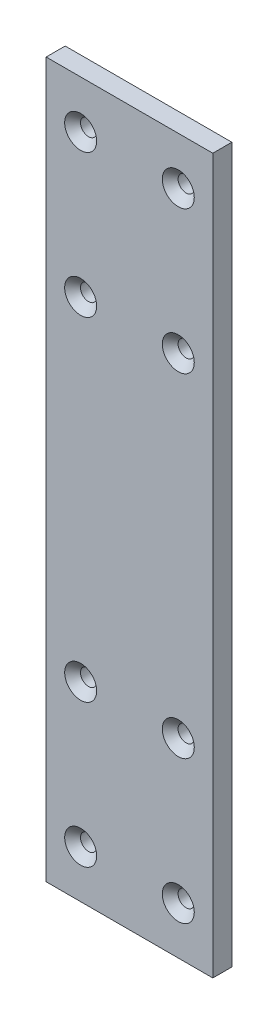
ISO-10303-21;
HEADER;
FILE_DESCRIPTION(('STEP AP214'),'2;1');
FILE_NAME('part.step','',(''),(''),'','','');
FILE_SCHEMA(('AUTOMOTIVE_DESIGN { 1 0 10303 214 1 1 1 1 }'));
ENDSEC;
DATA;
#1=APPLICATION_CONTEXT('core data for automotive mechanical design processes');
#2=APPLICATION_PROTOCOL_DEFINITION('international standard','automotive_design',2000,#1);
#3=PRODUCT_CONTEXT('',#1,'mechanical');
#4=PRODUCT('Part','Part','',(#3));
#5=PRODUCT_RELATED_PRODUCT_CATEGORY('part','',(#4));
#6=PRODUCT_DEFINITION_FORMATION('','',#4);
#7=PRODUCT_DEFINITION_CONTEXT('part definition',#1,'design');
#8=PRODUCT_DEFINITION('design','',#6,#7);
#9=PRODUCT_DEFINITION_SHAPE('','',#8);
#10=(LENGTH_UNIT() NAMED_UNIT(*) SI_UNIT(.MILLI.,.METRE.));
#11=(NAMED_UNIT(*) PLANE_ANGLE_UNIT() SI_UNIT($,.RADIAN.));
#12=(NAMED_UNIT(*) SI_UNIT($,.STERADIAN.) SOLID_ANGLE_UNIT());
#13=UNCERTAINTY_MEASURE_WITH_UNIT(LENGTH_MEASURE(1.E-05),#10,'distance_accuracy_value','');
#14=(GEOMETRIC_REPRESENTATION_CONTEXT(3) GLOBAL_UNCERTAINTY_ASSIGNED_CONTEXT((#13)) GLOBAL_UNIT_ASSIGNED_CONTEXT((#10,
#11,#12)) REPRESENTATION_CONTEXT('',''));
#15=CARTESIAN_POINT('',(0.,0.,0.));
#16=DIRECTION('',(0.,0.,1.));
#17=DIRECTION('',(1.,0.,0.));
#18=AXIS2_PLACEMENT_3D('',#15,#16,#17);
#19=CARTESIAN_POINT('',(17.5,75.,4.));
#20=DIRECTION('',(-1.,0.,0.));
#21=DIRECTION('',(0.,-1.,0.));
#22=AXIS2_PLACEMENT_3D('',#19,#20,#21);
#23=PLANE('',#22);
#24=DIRECTION('',(0.,1.,0.));
#25=VECTOR('',#24,1.);
#26=CARTESIAN_POINT('',(17.5,75.,0.));
#27=LINE('',#26,#25);
#28=CARTESIAN_POINT('',(17.5,-75.,0.));
#29=VERTEX_POINT('',#28);
#30=CARTESIAN_POINT('',(17.5,75.,0.));
#31=VERTEX_POINT('',#30);
#32=EDGE_CURVE('E98',#29,#31,#27,.T.);
#33=ORIENTED_EDGE('',*,*,#32,.T.);
#34=DIRECTION('',(0.,0.,-1.));
#35=VECTOR('',#34,1.);
#36=CARTESIAN_POINT('',(17.5,75.,4.));
#37=LINE('',#36,#35);
#38=CARTESIAN_POINT('',(17.5,75.,4.));
#39=VERTEX_POINT('',#38);
#40=EDGE_CURVE('E11',#39,#31,#37,.T.);
#41=ORIENTED_EDGE('',*,*,#40,.F.);
#42=DIRECTION('',(0.,1.,0.));
#43=VECTOR('',#42,1.);
#44=CARTESIAN_POINT('',(17.5,75.,4.));
#45=LINE('',#44,#43);
#46=CARTESIAN_POINT('',(17.5,-75.,4.));
#47=VERTEX_POINT('',#46);
#48=EDGE_CURVE('E86',#47,#39,#45,.T.);
#49=ORIENTED_EDGE('',*,*,#48,.F.);
#50=DIRECTION('',(0.,0.,-1.));
#51=VECTOR('',#50,1.);
#52=CARTESIAN_POINT('',(17.5,-75.,4.));
#53=LINE('',#52,#51);
#54=EDGE_CURVE('E94',#47,#29,#53,.T.);
#55=ORIENTED_EDGE('',*,*,#54,.T.);
#56=EDGE_LOOP('',(#33,#41,#49,#55));
#57=FACE_BOUND('',#56,.T.);
#58=ADVANCED_FACE('F35',(#57),#23,.F.);
#59=CARTESIAN_POINT('',(-17.5,75.,4.));
#60=DIRECTION('',(0.,-1.,0.));
#61=DIRECTION('',(0.,0.,-1.));
#62=AXIS2_PLACEMENT_3D('',#59,#60,#61);
#63=PLANE('',#62);
#64=DIRECTION('',(-1.,0.,0.));
#65=VECTOR('',#64,1.);
#66=CARTESIAN_POINT('',(-17.5,75.,0.));
#67=LINE('',#66,#65);
#68=CARTESIAN_POINT('',(-17.5,75.,0.));
#69=VERTEX_POINT('',#68);
#70=EDGE_CURVE('E90',#31,#69,#67,.T.);
#71=ORIENTED_EDGE('',*,*,#70,.T.);
#72=DIRECTION('',(0.,0.,-1.));
#73=VECTOR('',#72,1.);
#74=CARTESIAN_POINT('',(-17.5,75.,4.));
#75=LINE('',#74,#73);
#76=CARTESIAN_POINT('',(-17.5,75.,4.));
#77=VERTEX_POINT('',#76);
#78=EDGE_CURVE('E43',#77,#69,#75,.T.);
#79=ORIENTED_EDGE('',*,*,#78,.F.);
#80=DIRECTION('',(-1.,0.,0.));
#81=VECTOR('',#80,1.);
#82=CARTESIAN_POINT('',(-17.5,75.,4.));
#83=LINE('',#82,#81);
#84=EDGE_CURVE('E81',#39,#77,#83,.T.);
#85=ORIENTED_EDGE('',*,*,#84,.F.);
#86=ORIENTED_EDGE('',*,*,#40,.T.);
#87=EDGE_LOOP('',(#71,#79,#85,#86));
#88=FACE_BOUND('',#87,.T.);
#89=ADVANCED_FACE('F89',(#88),#63,.F.);
#90=CARTESIAN_POINT('',(-17.5,75.,4.));
#91=DIRECTION('',(1.,0.,0.));
#92=DIRECTION('',(0.,1.,0.));
#93=AXIS2_PLACEMENT_3D('',#90,#91,#92);
#94=PLANE('',#93);
#95=DIRECTION('',(0.,-1.,0.));
#96=VECTOR('',#95,1.);
#97=CARTESIAN_POINT('',(-17.5,75.,0.));
#98=LINE('',#97,#96);
#99=CARTESIAN_POINT('',(-17.5,-75.,0.));
#100=VERTEX_POINT('',#99);
#101=EDGE_CURVE('E68',#69,#100,#98,.T.);
#102=ORIENTED_EDGE('',*,*,#101,.T.);
#103=DIRECTION('',(0.,0.,-1.));
#104=VECTOR('',#103,1.);
#105=CARTESIAN_POINT('',(-17.5,-75.,4.));
#106=LINE('',#105,#104);
#107=CARTESIAN_POINT('',(-17.5,-75.,4.));
#108=VERTEX_POINT('',#107);
#109=EDGE_CURVE('E91',#108,#100,#106,.T.);
#110=ORIENTED_EDGE('',*,*,#109,.F.);
#111=DIRECTION('',(0.,-1.,0.));
#112=VECTOR('',#111,1.);
#113=CARTESIAN_POINT('',(-17.5,75.,4.));
#114=LINE('',#113,#112);
#115=EDGE_CURVE('E84',#77,#108,#114,.T.);
#116=ORIENTED_EDGE('',*,*,#115,.F.);
#117=ORIENTED_EDGE('',*,*,#78,.T.);
#118=EDGE_LOOP('',(#102,#110,#116,#117));
#119=FACE_BOUND('',#118,.T.);
#120=ADVANCED_FACE('F92',(#119),#94,.F.);
#121=CARTESIAN_POINT('',(-17.5,-75.,4.));
#122=DIRECTION('',(0.,1.,0.));
#123=DIRECTION('',(0.,0.,1.));
#124=AXIS2_PLACEMENT_3D('',#121,#122,#123);
#125=PLANE('',#124);
#126=DIRECTION('',(1.,0.,0.));
#127=VECTOR('',#126,1.);
#128=CARTESIAN_POINT('',(-17.5,-75.,0.));
#129=LINE('',#128,#127);
#130=EDGE_CURVE('E74',#100,#29,#129,.T.);
#131=ORIENTED_EDGE('',*,*,#130,.T.);
#132=ORIENTED_EDGE('',*,*,#54,.F.);
#133=DIRECTION('',(1.,0.,0.));
#134=VECTOR('',#133,1.);
#135=CARTESIAN_POINT('',(-17.5,-75.,4.));
#136=LINE('',#135,#134);
#137=EDGE_CURVE('E51',#108,#47,#136,.T.);
#138=ORIENTED_EDGE('',*,*,#137,.F.);
#139=ORIENTED_EDGE('',*,*,#109,.T.);
#140=EDGE_LOOP('',(#131,#132,#138,#139));
#141=FACE_BOUND('',#140,.T.);
#142=ADVANCED_FACE('F106',(#141),#125,.F.);
#143=CARTESIAN_POINT('',(0.,0.,4.));
#144=DIRECTION('',(0.,0.,1.));
#145=DIRECTION('',(1.,0.,0.));
#146=AXIS2_PLACEMENT_3D('',#143,#144,#145);
#147=PLANE('',#146);
#148=CARTESIAN_POINT('',(-10.25,-35.,4.));
#149=DIRECTION('',(0.,0.,1.));
#150=DIRECTION('',(1.,0.,0.));
#151=AXIS2_PLACEMENT_3D('',#148,#149,#150);
#152=CIRCLE('',#151,3.36);
#153=CARTESIAN_POINT('',(-6.88999999999999,-35.,4.));
#154=VERTEX_POINT('',#153);
#155=EDGE_CURVE('E180',#154,#154,#152,.T.);
#156=ORIENTED_EDGE('',*,*,#155,.F.);
#157=EDGE_LOOP('',(#156));
#158=FACE_BOUND('',#157,.T.);
#159=CARTESIAN_POINT('',(10.25,-35.,4.));
#160=DIRECTION('',(0.,0.,1.));
#161=DIRECTION('',(1.,0.,0.));
#162=AXIS2_PLACEMENT_3D('',#159,#160,#161);
#163=CIRCLE('',#162,3.36);
#164=CARTESIAN_POINT('',(13.61,-35.,4.));
#165=VERTEX_POINT('',#164);
#166=EDGE_CURVE('E171',#165,#165,#163,.T.);
#167=ORIENTED_EDGE('',*,*,#166,.F.);
#168=EDGE_LOOP('',(#167));
#169=FACE_BOUND('',#168,.T.);
#170=CARTESIAN_POINT('',(10.25,-65.,4.));
#171=DIRECTION('',(0.,0.,1.));
#172=DIRECTION('',(1.,0.,0.));
#173=AXIS2_PLACEMENT_3D('',#170,#171,#172);
#174=CIRCLE('',#173,3.36);
#175=CARTESIAN_POINT('',(13.61,-65.,4.));
#176=VERTEX_POINT('',#175);
#177=EDGE_CURVE('E162',#176,#176,#174,.T.);
#178=ORIENTED_EDGE('',*,*,#177,.F.);
#179=EDGE_LOOP('',(#178));
#180=FACE_BOUND('',#179,.T.);
#181=CARTESIAN_POINT('',(-10.25,-65.,4.));
#182=DIRECTION('',(0.,0.,1.));
#183=DIRECTION('',(1.,0.,0.));
#184=AXIS2_PLACEMENT_3D('',#181,#182,#183);
#185=CIRCLE('',#184,3.36);
#186=CARTESIAN_POINT('',(-6.88999999999998,-65.,4.));
#187=VERTEX_POINT('',#186);
#188=EDGE_CURVE('E153',#187,#187,#185,.T.);
#189=ORIENTED_EDGE('',*,*,#188,.F.);
#190=EDGE_LOOP('',(#189));
#191=FACE_BOUND('',#190,.T.);
#192=CARTESIAN_POINT('',(-10.25,65.,4.));
#193=DIRECTION('',(0.,0.,1.));
#194=DIRECTION('',(1.,0.,0.));
#195=AXIS2_PLACEMENT_3D('',#192,#193,#194);
#196=CIRCLE('',#195,3.36);
#197=CARTESIAN_POINT('',(-6.88999999999998,65.,4.));
#198=VERTEX_POINT('',#197);
#199=EDGE_CURVE('E144',#198,#198,#196,.T.);
#200=ORIENTED_EDGE('',*,*,#199,.F.);
#201=EDGE_LOOP('',(#200));
#202=FACE_BOUND('',#201,.T.);
#203=CARTESIAN_POINT('',(10.25,65.,4.));
#204=DIRECTION('',(0.,0.,1.));
#205=DIRECTION('',(1.,0.,0.));
#206=AXIS2_PLACEMENT_3D('',#203,#204,#205);
#207=CIRCLE('',#206,3.36);
#208=CARTESIAN_POINT('',(13.61,65.,4.));
#209=VERTEX_POINT('',#208);
#210=EDGE_CURVE('E135',#209,#209,#207,.T.);
#211=ORIENTED_EDGE('',*,*,#210,.F.);
#212=EDGE_LOOP('',(#211));
#213=FACE_BOUND('',#212,.T.);
#214=CARTESIAN_POINT('',(10.25,35.,4.));
#215=DIRECTION('',(0.,0.,1.));
#216=DIRECTION('',(1.,0.,0.));
#217=AXIS2_PLACEMENT_3D('',#214,#215,#216);
#218=CIRCLE('',#217,3.36);
#219=CARTESIAN_POINT('',(13.61,35.,4.));
#220=VERTEX_POINT('',#219);
#221=EDGE_CURVE('E126',#220,#220,#218,.T.);
#222=ORIENTED_EDGE('',*,*,#221,.F.);
#223=EDGE_LOOP('',(#222));
#224=FACE_BOUND('',#223,.T.);
#225=CARTESIAN_POINT('',(-10.25,35.,4.));
#226=DIRECTION('',(0.,0.,1.));
#227=DIRECTION('',(1.,0.,0.));
#228=AXIS2_PLACEMENT_3D('',#225,#226,#227);
#229=CIRCLE('',#228,3.36);
#230=CARTESIAN_POINT('',(-6.88999999999999,35.,4.));
#231=VERTEX_POINT('',#230);
#232=EDGE_CURVE('E117',#231,#231,#229,.T.);
#233=ORIENTED_EDGE('',*,*,#232,.F.);
#234=EDGE_LOOP('',(#233));
#235=FACE_BOUND('',#234,.T.);
#236=ORIENTED_EDGE('',*,*,#48,.T.);
#237=ORIENTED_EDGE('',*,*,#84,.T.);
#238=ORIENTED_EDGE('',*,*,#115,.T.);
#239=ORIENTED_EDGE('',*,*,#137,.T.);
#240=EDGE_LOOP('',(#236,#237,#238,#239));
#241=FACE_BOUND('',#240,.T.);
#242=ADVANCED_FACE('F82',(#158,#169,#180,#191,#202,#213,#224,#235,#241),#147,.T.);
#243=CARTESIAN_POINT('',(0.,0.,0.));
#244=DIRECTION('',(0.,0.,1.));
#245=DIRECTION('',(1.,0.,0.));
#246=AXIS2_PLACEMENT_3D('',#243,#244,#245);
#247=PLANE('',#246);
#248=CARTESIAN_POINT('',(-10.25,-35.,0.));
#249=DIRECTION('',(0.,0.,1.));
#250=DIRECTION('',(1.,0.,0.));
#251=AXIS2_PLACEMENT_3D('',#248,#249,#250);
#252=CIRCLE('',#251,1.7);
#253=CARTESIAN_POINT('',(-8.54999999999999,-35.,0.));
#254=VERTEX_POINT('',#253);
#255=EDGE_CURVE('E174',#254,#254,#252,.T.);
#256=ORIENTED_EDGE('',*,*,#255,.T.);
#257=EDGE_LOOP('',(#256));
#258=FACE_BOUND('',#257,.T.);
#259=CARTESIAN_POINT('',(10.25,-35.,0.));
#260=DIRECTION('',(0.,0.,1.));
#261=DIRECTION('',(1.,0.,0.));
#262=AXIS2_PLACEMENT_3D('',#259,#260,#261);
#263=CIRCLE('',#262,1.7);
#264=CARTESIAN_POINT('',(11.95,-35.,0.));
#265=VERTEX_POINT('',#264);
#266=EDGE_CURVE('E165',#265,#265,#263,.T.);
#267=ORIENTED_EDGE('',*,*,#266,.T.);
#268=EDGE_LOOP('',(#267));
#269=FACE_BOUND('',#268,.T.);
#270=CARTESIAN_POINT('',(10.25,-65.,0.));
#271=DIRECTION('',(0.,0.,1.));
#272=DIRECTION('',(1.,0.,0.));
#273=AXIS2_PLACEMENT_3D('',#270,#271,#272);
#274=CIRCLE('',#273,1.7);
#275=CARTESIAN_POINT('',(11.95,-65.,0.));
#276=VERTEX_POINT('',#275);
#277=EDGE_CURVE('E156',#276,#276,#274,.T.);
#278=ORIENTED_EDGE('',*,*,#277,.T.);
#279=EDGE_LOOP('',(#278));
#280=FACE_BOUND('',#279,.T.);
#281=CARTESIAN_POINT('',(-10.25,-65.,0.));
#282=DIRECTION('',(0.,0.,1.));
#283=DIRECTION('',(1.,0.,0.));
#284=AXIS2_PLACEMENT_3D('',#281,#282,#283);
#285=CIRCLE('',#284,1.7);
#286=CARTESIAN_POINT('',(-8.54999999999999,-65.,0.));
#287=VERTEX_POINT('',#286);
#288=EDGE_CURVE('E147',#287,#287,#285,.T.);
#289=ORIENTED_EDGE('',*,*,#288,.T.);
#290=EDGE_LOOP('',(#289));
#291=FACE_BOUND('',#290,.T.);
#292=CARTESIAN_POINT('',(-10.25,65.,0.));
#293=DIRECTION('',(0.,0.,1.));
#294=DIRECTION('',(1.,0.,0.));
#295=AXIS2_PLACEMENT_3D('',#292,#293,#294);
#296=CIRCLE('',#295,1.7);
#297=CARTESIAN_POINT('',(-8.54999999999999,65.,0.));
#298=VERTEX_POINT('',#297);
#299=EDGE_CURVE('E138',#298,#298,#296,.T.);
#300=ORIENTED_EDGE('',*,*,#299,.T.);
#301=EDGE_LOOP('',(#300));
#302=FACE_BOUND('',#301,.T.);
#303=CARTESIAN_POINT('',(10.25,65.,0.));
#304=DIRECTION('',(0.,0.,1.));
#305=DIRECTION('',(1.,0.,0.));
#306=AXIS2_PLACEMENT_3D('',#303,#304,#305);
#307=CIRCLE('',#306,1.7);
#308=CARTESIAN_POINT('',(11.95,65.,0.));
#309=VERTEX_POINT('',#308);
#310=EDGE_CURVE('E129',#309,#309,#307,.T.);
#311=ORIENTED_EDGE('',*,*,#310,.T.);
#312=EDGE_LOOP('',(#311));
#313=FACE_BOUND('',#312,.T.);
#314=CARTESIAN_POINT('',(10.25,35.,0.));
#315=DIRECTION('',(0.,0.,1.));
#316=DIRECTION('',(1.,0.,0.));
#317=AXIS2_PLACEMENT_3D('',#314,#315,#316);
#318=CIRCLE('',#317,1.7);
#319=CARTESIAN_POINT('',(11.95,35.,0.));
#320=VERTEX_POINT('',#319);
#321=EDGE_CURVE('E120',#320,#320,#318,.T.);
#322=ORIENTED_EDGE('',*,*,#321,.T.);
#323=EDGE_LOOP('',(#322));
#324=FACE_BOUND('',#323,.T.);
#325=CARTESIAN_POINT('',(-10.25,35.,0.));
#326=DIRECTION('',(0.,0.,1.));
#327=DIRECTION('',(1.,0.,0.));
#328=AXIS2_PLACEMENT_3D('',#325,#326,#327);
#329=CIRCLE('',#328,1.7);
#330=CARTESIAN_POINT('',(-8.54999999999999,35.,0.));
#331=VERTEX_POINT('',#330);
#332=EDGE_CURVE('E101',#331,#331,#329,.T.);
#333=ORIENTED_EDGE('',*,*,#332,.T.);
#334=EDGE_LOOP('',(#333));
#335=FACE_BOUND('',#334,.T.);
#336=ORIENTED_EDGE('',*,*,#32,.F.);
#337=ORIENTED_EDGE('',*,*,#130,.F.);
#338=ORIENTED_EDGE('',*,*,#101,.F.);
#339=ORIENTED_EDGE('',*,*,#70,.F.);
#340=EDGE_LOOP('',(#336,#337,#338,#339));
#341=FACE_BOUND('',#340,.T.);
#342=ADVANCED_FACE('F109',(#258,#269,#280,#291,#302,#313,#324,#335,#341),#247,.F.);
#343=CARTESIAN_POINT('',(-10.25,35.,4.));
#344=DIRECTION('',(0.,0.,1.));
#345=DIRECTION('',(1.,0.,0.));
#346=AXIS2_PLACEMENT_3D('',#343,#344,#345);
#347=CYLINDRICAL_SURFACE('',#346,1.7);
#348=ORIENTED_EDGE('',*,*,#332,.F.);
#349=EDGE_LOOP('',(#348));
#350=FACE_BOUND('',#349,.T.);
#351=CARTESIAN_POINT('',(-10.25,35.,2.34));
#352=DIRECTION('',(0.,0.,1.));
#353=DIRECTION('',(1.,0.,0.));
#354=AXIS2_PLACEMENT_3D('',#351,#352,#353);
#355=CIRCLE('',#354,1.7);
#356=CARTESIAN_POINT('',(-8.54999999999999,35.,2.34));
#357=VERTEX_POINT('',#356);
#358=EDGE_CURVE('E114',#357,#357,#355,.T.);
#359=ORIENTED_EDGE('',*,*,#358,.T.);
#360=EDGE_LOOP('',(#359));
#361=FACE_BOUND('',#360,.T.);
#362=ADVANCED_FACE('F206',(#350,#361),#347,.F.);
#363=CARTESIAN_POINT('',(-10.25,35.,4.));
#364=DIRECTION('',(0.,0.,1.));
#365=DIRECTION('',(1.,0.,0.));
#366=AXIS2_PLACEMENT_3D('',#363,#364,#365);
#367=CONICAL_SURFACE('',#366,3.36,0.785398163397448);
#368=ORIENTED_EDGE('',*,*,#358,.F.);
#369=EDGE_LOOP('',(#368));
#370=FACE_BOUND('',#369,.T.);
#371=ORIENTED_EDGE('',*,*,#232,.T.);
#372=EDGE_LOOP('',(#371));
#373=FACE_BOUND('',#372,.T.);
#374=ADVANCED_FACE('F203',(#370,#373),#367,.F.);
#375=CARTESIAN_POINT('',(10.25,35.,4.));
#376=DIRECTION('',(0.,0.,1.));
#377=DIRECTION('',(1.,0.,0.));
#378=AXIS2_PLACEMENT_3D('',#375,#376,#377);
#379=CYLINDRICAL_SURFACE('',#378,1.7);
#380=ORIENTED_EDGE('',*,*,#321,.F.);
#381=EDGE_LOOP('',(#380));
#382=FACE_BOUND('',#381,.T.);
#383=CARTESIAN_POINT('',(10.25,35.,2.34));
#384=DIRECTION('',(0.,0.,1.));
#385=DIRECTION('',(1.,0.,0.));
#386=AXIS2_PLACEMENT_3D('',#383,#384,#385);
#387=CIRCLE('',#386,1.7);
#388=CARTESIAN_POINT('',(11.95,35.,2.34));
#389=VERTEX_POINT('',#388);
#390=EDGE_CURVE('E123',#389,#389,#387,.T.);
#391=ORIENTED_EDGE('',*,*,#390,.T.);
#392=EDGE_LOOP('',(#391));
#393=FACE_BOUND('',#392,.T.);
#394=ADVANCED_FACE('F205',(#382,#393),#379,.F.);
#395=CARTESIAN_POINT('',(10.25,35.,4.));
#396=DIRECTION('',(0.,0.,1.));
#397=DIRECTION('',(1.,0.,0.));
#398=AXIS2_PLACEMENT_3D('',#395,#396,#397);
#399=CONICAL_SURFACE('',#398,3.36,0.785398163397448);
#400=ORIENTED_EDGE('',*,*,#390,.F.);
#401=EDGE_LOOP('',(#400));
#402=FACE_BOUND('',#401,.T.);
#403=ORIENTED_EDGE('',*,*,#221,.T.);
#404=EDGE_LOOP('',(#403));
#405=FACE_BOUND('',#404,.T.);
#406=ADVANCED_FACE('F213',(#402,#405),#399,.F.);
#407=CARTESIAN_POINT('',(10.25,65.,4.));
#408=DIRECTION('',(0.,0.,1.));
#409=DIRECTION('',(1.,0.,0.));
#410=AXIS2_PLACEMENT_3D('',#407,#408,#409);
#411=CYLINDRICAL_SURFACE('',#410,1.7);
#412=ORIENTED_EDGE('',*,*,#310,.F.);
#413=EDGE_LOOP('',(#412));
#414=FACE_BOUND('',#413,.T.);
#415=CARTESIAN_POINT('',(10.25,65.,2.34));
#416=DIRECTION('',(0.,0.,1.));
#417=DIRECTION('',(1.,0.,0.));
#418=AXIS2_PLACEMENT_3D('',#415,#416,#417);
#419=CIRCLE('',#418,1.7);
#420=CARTESIAN_POINT('',(11.95,65.,2.34));
#421=VERTEX_POINT('',#420);
#422=EDGE_CURVE('E132',#421,#421,#419,.T.);
#423=ORIENTED_EDGE('',*,*,#422,.T.);
#424=EDGE_LOOP('',(#423));
#425=FACE_BOUND('',#424,.T.);
#426=ADVANCED_FACE('F255',(#414,#425),#411,.F.);
#427=CARTESIAN_POINT('',(10.25,65.,4.));
#428=DIRECTION('',(0.,0.,1.));
#429=DIRECTION('',(1.,0.,0.));
#430=AXIS2_PLACEMENT_3D('',#427,#428,#429);
#431=CONICAL_SURFACE('',#430,3.36,0.785398163397448);
#432=ORIENTED_EDGE('',*,*,#422,.F.);
#433=EDGE_LOOP('',(#432));
#434=FACE_BOUND('',#433,.T.);
#435=ORIENTED_EDGE('',*,*,#210,.T.);
#436=EDGE_LOOP('',(#435));
#437=FACE_BOUND('',#436,.T.);
#438=ADVANCED_FACE('F260',(#434,#437),#431,.F.);
#439=CARTESIAN_POINT('',(-10.25,65.,4.));
#440=DIRECTION('',(0.,0.,1.));
#441=DIRECTION('',(1.,0.,0.));
#442=AXIS2_PLACEMENT_3D('',#439,#440,#441);
#443=CYLINDRICAL_SURFACE('',#442,1.7);
#444=ORIENTED_EDGE('',*,*,#299,.F.);
#445=EDGE_LOOP('',(#444));
#446=FACE_BOUND('',#445,.T.);
#447=CARTESIAN_POINT('',(-10.25,65.,2.34));
#448=DIRECTION('',(0.,0.,1.));
#449=DIRECTION('',(1.,0.,0.));
#450=AXIS2_PLACEMENT_3D('',#447,#448,#449);
#451=CIRCLE('',#450,1.7);
#452=CARTESIAN_POINT('',(-8.54999999999999,65.,2.34));
#453=VERTEX_POINT('',#452);
#454=EDGE_CURVE('E141',#453,#453,#451,.T.);
#455=ORIENTED_EDGE('',*,*,#454,.T.);
#456=EDGE_LOOP('',(#455));
#457=FACE_BOUND('',#456,.T.);
#458=ADVANCED_FACE('F266',(#446,#457),#443,.F.);
#459=CARTESIAN_POINT('',(-10.25,65.,4.));
#460=DIRECTION('',(0.,0.,1.));
#461=DIRECTION('',(1.,0.,0.));
#462=AXIS2_PLACEMENT_3D('',#459,#460,#461);
#463=CONICAL_SURFACE('',#462,3.36,0.785398163397448);
#464=ORIENTED_EDGE('',*,*,#454,.F.);
#465=EDGE_LOOP('',(#464));
#466=FACE_BOUND('',#465,.T.);
#467=ORIENTED_EDGE('',*,*,#199,.T.);
#468=EDGE_LOOP('',(#467));
#469=FACE_BOUND('',#468,.T.);
#470=ADVANCED_FACE('F270',(#466,#469),#463,.F.);
#471=CARTESIAN_POINT('',(-10.25,-65.,4.));
#472=DIRECTION('',(0.,0.,1.));
#473=DIRECTION('',(1.,0.,0.));
#474=AXIS2_PLACEMENT_3D('',#471,#472,#473);
#475=CYLINDRICAL_SURFACE('',#474,1.7);
#476=ORIENTED_EDGE('',*,*,#288,.F.);
#477=EDGE_LOOP('',(#476));
#478=FACE_BOUND('',#477,.T.);
#479=CARTESIAN_POINT('',(-10.25,-65.,2.34));
#480=DIRECTION('',(0.,0.,1.));
#481=DIRECTION('',(1.,0.,0.));
#482=AXIS2_PLACEMENT_3D('',#479,#480,#481);
#483=CIRCLE('',#482,1.7);
#484=CARTESIAN_POINT('',(-8.54999999999999,-65.,2.34));
#485=VERTEX_POINT('',#484);
#486=EDGE_CURVE('E150',#485,#485,#483,.T.);
#487=ORIENTED_EDGE('',*,*,#486,.T.);
#488=EDGE_LOOP('',(#487));
#489=FACE_BOUND('',#488,.T.);
#490=ADVANCED_FACE('F274',(#478,#489),#475,.F.);
#491=CARTESIAN_POINT('',(-10.25,-65.,4.));
#492=DIRECTION('',(0.,0.,1.));
#493=DIRECTION('',(1.,0.,0.));
#494=AXIS2_PLACEMENT_3D('',#491,#492,#493);
#495=CONICAL_SURFACE('',#494,3.36,0.785398163397448);
#496=ORIENTED_EDGE('',*,*,#486,.F.);
#497=EDGE_LOOP('',(#496));
#498=FACE_BOUND('',#497,.T.);
#499=ORIENTED_EDGE('',*,*,#188,.T.);
#500=EDGE_LOOP('',(#499));
#501=FACE_BOUND('',#500,.T.);
#502=ADVANCED_FACE('F278',(#498,#501),#495,.F.);
#503=CARTESIAN_POINT('',(10.25,-65.,4.));
#504=DIRECTION('',(0.,0.,1.));
#505=DIRECTION('',(1.,0.,0.));
#506=AXIS2_PLACEMENT_3D('',#503,#504,#505);
#507=CYLINDRICAL_SURFACE('',#506,1.7);
#508=ORIENTED_EDGE('',*,*,#277,.F.);
#509=EDGE_LOOP('',(#508));
#510=FACE_BOUND('',#509,.T.);
#511=CARTESIAN_POINT('',(10.25,-65.,2.34));
#512=DIRECTION('',(0.,0.,1.));
#513=DIRECTION('',(1.,0.,0.));
#514=AXIS2_PLACEMENT_3D('',#511,#512,#513);
#515=CIRCLE('',#514,1.7);
#516=CARTESIAN_POINT('',(11.95,-65.,2.34));
#517=VERTEX_POINT('',#516);
#518=EDGE_CURVE('E159',#517,#517,#515,.T.);
#519=ORIENTED_EDGE('',*,*,#518,.T.);
#520=EDGE_LOOP('',(#519));
#521=FACE_BOUND('',#520,.T.);
#522=ADVANCED_FACE('F282',(#510,#521),#507,.F.);
#523=CARTESIAN_POINT('',(10.25,-65.,4.));
#524=DIRECTION('',(0.,0.,1.));
#525=DIRECTION('',(1.,0.,0.));
#526=AXIS2_PLACEMENT_3D('',#523,#524,#525);
#527=CONICAL_SURFACE('',#526,3.36,0.785398163397448);
#528=ORIENTED_EDGE('',*,*,#518,.F.);
#529=EDGE_LOOP('',(#528));
#530=FACE_BOUND('',#529,.T.);
#531=ORIENTED_EDGE('',*,*,#177,.T.);
#532=EDGE_LOOP('',(#531));
#533=FACE_BOUND('',#532,.T.);
#534=ADVANCED_FACE('F286',(#530,#533),#527,.F.);
#535=CARTESIAN_POINT('',(10.25,-35.,4.));
#536=DIRECTION('',(0.,0.,1.));
#537=DIRECTION('',(1.,0.,0.));
#538=AXIS2_PLACEMENT_3D('',#535,#536,#537);
#539=CYLINDRICAL_SURFACE('',#538,1.7);
#540=ORIENTED_EDGE('',*,*,#266,.F.);
#541=EDGE_LOOP('',(#540));
#542=FACE_BOUND('',#541,.T.);
#543=CARTESIAN_POINT('',(10.25,-35.,2.34));
#544=DIRECTION('',(0.,0.,1.));
#545=DIRECTION('',(1.,0.,0.));
#546=AXIS2_PLACEMENT_3D('',#543,#544,#545);
#547=CIRCLE('',#546,1.7);
#548=CARTESIAN_POINT('',(11.95,-35.,2.34));
#549=VERTEX_POINT('',#548);
#550=EDGE_CURVE('E168',#549,#549,#547,.T.);
#551=ORIENTED_EDGE('',*,*,#550,.T.);
#552=EDGE_LOOP('',(#551));
#553=FACE_BOUND('',#552,.T.);
#554=ADVANCED_FACE('F290',(#542,#553),#539,.F.);
#555=CARTESIAN_POINT('',(10.25,-35.,4.));
#556=DIRECTION('',(0.,0.,1.));
#557=DIRECTION('',(1.,0.,0.));
#558=AXIS2_PLACEMENT_3D('',#555,#556,#557);
#559=CONICAL_SURFACE('',#558,3.36,0.785398163397448);
#560=ORIENTED_EDGE('',*,*,#550,.F.);
#561=EDGE_LOOP('',(#560));
#562=FACE_BOUND('',#561,.T.);
#563=ORIENTED_EDGE('',*,*,#166,.T.);
#564=EDGE_LOOP('',(#563));
#565=FACE_BOUND('',#564,.T.);
#566=ADVANCED_FACE('F294',(#562,#565),#559,.F.);
#567=CARTESIAN_POINT('',(-10.25,-35.,4.));
#568=DIRECTION('',(0.,0.,1.));
#569=DIRECTION('',(1.,0.,0.));
#570=AXIS2_PLACEMENT_3D('',#567,#568,#569);
#571=CYLINDRICAL_SURFACE('',#570,1.7);
#572=ORIENTED_EDGE('',*,*,#255,.F.);
#573=EDGE_LOOP('',(#572));
#574=FACE_BOUND('',#573,.T.);
#575=CARTESIAN_POINT('',(-10.25,-35.,2.34));
#576=DIRECTION('',(0.,0.,1.));
#577=DIRECTION('',(1.,0.,0.));
#578=AXIS2_PLACEMENT_3D('',#575,#576,#577);
#579=CIRCLE('',#578,1.7);
#580=CARTESIAN_POINT('',(-8.54999999999999,-35.,2.34));
#581=VERTEX_POINT('',#580);
#582=EDGE_CURVE('E177',#581,#581,#579,.T.);
#583=ORIENTED_EDGE('',*,*,#582,.T.);
#584=EDGE_LOOP('',(#583));
#585=FACE_BOUND('',#584,.T.);
#586=ADVANCED_FACE('F298',(#574,#585),#571,.F.);
#587=CARTESIAN_POINT('',(-10.25,-35.,4.));
#588=DIRECTION('',(0.,0.,1.));
#589=DIRECTION('',(1.,0.,0.));
#590=AXIS2_PLACEMENT_3D('',#587,#588,#589);
#591=CONICAL_SURFACE('',#590,3.36,0.785398163397448);
#592=ORIENTED_EDGE('',*,*,#582,.F.);
#593=EDGE_LOOP('',(#592));
#594=FACE_BOUND('',#593,.T.);
#595=ORIENTED_EDGE('',*,*,#155,.T.);
#596=EDGE_LOOP('',(#595));
#597=FACE_BOUND('',#596,.T.);
#598=ADVANCED_FACE('F184',(#594,#597),#591,.F.);
#599=CLOSED_SHELL('',(#58,#89,#120,#142,#242,#342,#362,#374,#394,#406,#426,#438,#458,#470,#490,
#502,#522,#534,#554,#566,#586,#598));
#600=MANIFOLD_SOLID_BREP('B2',#599);
#601=ADVANCED_BREP_SHAPE_REPRESENTATION('',(#18,#600),#14);
#602=SHAPE_DEFINITION_REPRESENTATION(#9,#601);
ENDSEC;
END-ISO-10303-21;
